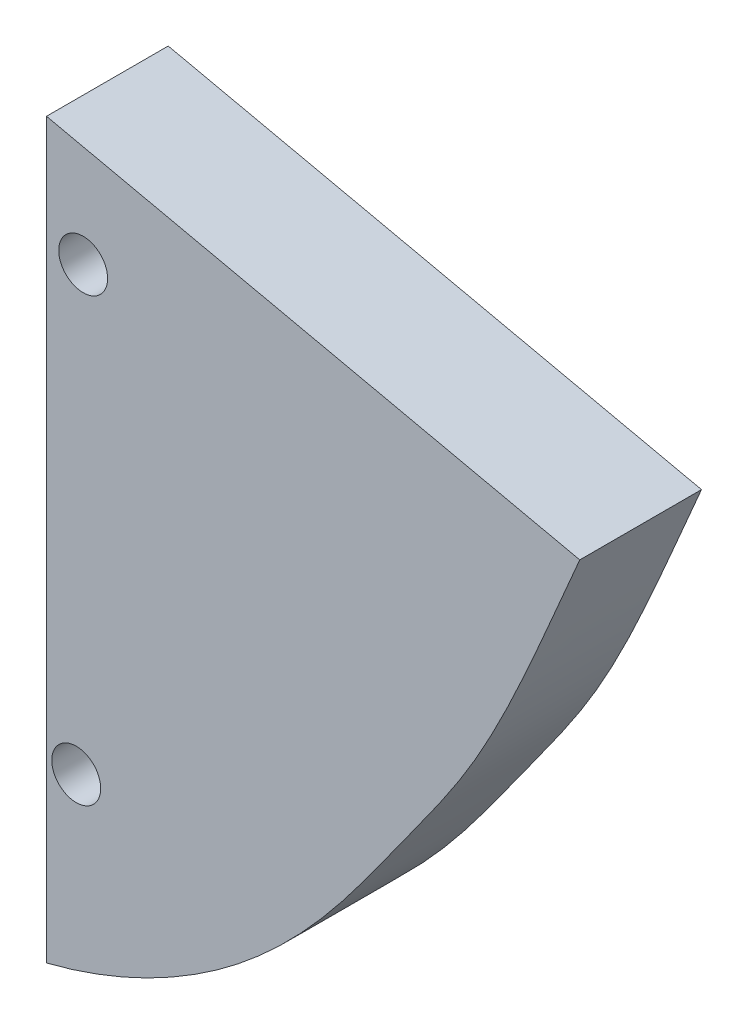
ISO-10303-21;
HEADER;
FILE_DESCRIPTION(('STEP AP214'),'2;1');
FILE_NAME('part.step','',(''),(''),'','','');
FILE_SCHEMA(('AUTOMOTIVE_DESIGN { 1 0 10303 214 1 1 1 1 }'));
ENDSEC;
DATA;
#1=APPLICATION_CONTEXT('core data for automotive mechanical design processes');
#2=APPLICATION_PROTOCOL_DEFINITION('international standard','automotive_design',2000,#1);
#3=PRODUCT_CONTEXT('',#1,'mechanical');
#4=PRODUCT('Part','Part','',(#3));
#5=PRODUCT_RELATED_PRODUCT_CATEGORY('part','',(#4));
#6=PRODUCT_DEFINITION_FORMATION('','',#4);
#7=PRODUCT_DEFINITION_CONTEXT('part definition',#1,'design');
#8=PRODUCT_DEFINITION('design','',#6,#7);
#9=PRODUCT_DEFINITION_SHAPE('','',#8);
#10=(LENGTH_UNIT() NAMED_UNIT(*) SI_UNIT(.MILLI.,.METRE.));
#11=(NAMED_UNIT(*) PLANE_ANGLE_UNIT() SI_UNIT($,.RADIAN.));
#12=(NAMED_UNIT(*) SI_UNIT($,.STERADIAN.) SOLID_ANGLE_UNIT());
#13=UNCERTAINTY_MEASURE_WITH_UNIT(LENGTH_MEASURE(1.E-05),#10,'distance_accuracy_value','');
#14=(GEOMETRIC_REPRESENTATION_CONTEXT(3) GLOBAL_UNCERTAINTY_ASSIGNED_CONTEXT((#13)) GLOBAL_UNIT_ASSIGNED_CONTEXT((#10,
#11,#12)) REPRESENTATION_CONTEXT('',''));
#15=CARTESIAN_POINT('',(0.,0.,0.));
#16=DIRECTION('',(0.,0.,1.));
#17=DIRECTION('',(1.,0.,0.));
#18=AXIS2_PLACEMENT_3D('',#15,#16,#17);
#19=CARTESIAN_POINT('',(0.,-4.,4.98));
#20=CARTESIAN_POINT('',(2.9067649308255,-3.2679038016806,4.98));
#21=CARTESIAN_POINT('',(7.18942457178566,-1.09186569585447,4.98));
#22=CARTESIAN_POINT('',(11.6437366225917,3.46078876085689,4.98));
#23=CARTESIAN_POINT('',(14.473771474054,7.48084114476038,4.98));
#24=CARTESIAN_POINT('',(17.3377801250555,11.3692603646736,4.98));
#25=CARTESIAN_POINT('',(19.6480759454628,16.032903585408,4.98));
#26=CARTESIAN_POINT('',(21.0177099191527,19.3555821053084,4.98));
#27=CARTESIAN_POINT('',(21.8168612474579,21.1914102612986,4.98));
#28=B_SPLINE_CURVE_WITH_KNOTS('',3,(#19,#20,#21,#22,#23,#24,#25,#26,#27),.UNSPECIFIED.,.F.,.F.,
(4,1,1,1,1,1,4),(0.,0.260017683149919,0.407189490212177,0.549306039511552,0.687276252070777,
0.826057345620301,1.),.UNSPECIFIED.);
#29=DIRECTION('',(0.,0.,-1.));
#30=VECTOR('',#29,1.);
#31=SURFACE_OF_LINEAR_EXTRUSION('',#28,#30);
#32=CARTESIAN_POINT('',(0.,-4.,0.));
#33=CARTESIAN_POINT('',(2.9067649308255,-3.2679038016806,0.));
#34=CARTESIAN_POINT('',(7.18942457178566,-1.09186569585447,0.));
#35=CARTESIAN_POINT('',(11.6437366225917,3.46078876085689,0.));
#36=CARTESIAN_POINT('',(14.473771474054,7.48084114476038,0.));
#37=CARTESIAN_POINT('',(17.3377801250555,11.3692603646736,0.));
#38=CARTESIAN_POINT('',(19.6480759454628,16.032903585408,0.));
#39=CARTESIAN_POINT('',(21.0177099191527,19.3555821053084,0.));
#40=CARTESIAN_POINT('',(21.8168612474579,21.1914102612986,0.));
#41=B_SPLINE_CURVE_WITH_KNOTS('',3,(#32,#33,#34,#35,#36,#37,#38,#39,#40),.UNSPECIFIED.,.F.,.F.,
(4,1,1,1,1,1,4),(0.,0.260017683149919,0.407189490212177,0.549306039511552,0.687276252070777,
0.826057345620301,1.),.UNSPECIFIED.);
#42=CARTESIAN_POINT('',(0.,-4.,0.));
#43=VERTEX_POINT('',#42);
#44=CARTESIAN_POINT('',(21.8168612474579,21.1914102612986,0.));
#45=VERTEX_POINT('',#44);
#46=EDGE_CURVE('E85',#43,#45,#41,.T.);
#47=ORIENTED_EDGE('',*,*,#46,.T.);
#48=DIRECTION('',(0.,0.,-1.));
#49=VECTOR('',#48,1.);
#50=CARTESIAN_POINT('',(21.8168612474579,21.1914102612986,4.98));
#51=LINE('',#50,#49);
#52=CARTESIAN_POINT('',(21.8168612474579,21.1914102612986,4.98));
#53=VERTEX_POINT('',#52);
#54=EDGE_CURVE('E11',#53,#45,#51,.T.);
#55=ORIENTED_EDGE('',*,*,#54,.F.);
#56=CARTESIAN_POINT('',(0.,-4.,4.98));
#57=VERTEX_POINT('',#56);
#58=EDGE_CURVE('E79',#57,#53,#28,.T.);
#59=ORIENTED_EDGE('',*,*,#58,.F.);
#60=DIRECTION('',(0.,0.,-1.));
#61=VECTOR('',#60,1.);
#62=CARTESIAN_POINT('',(0.,-4.,4.98));
#63=LINE('',#62,#61);
#64=EDGE_CURVE('E86',#57,#43,#63,.T.);
#65=ORIENTED_EDGE('',*,*,#64,.T.);
#66=EDGE_LOOP('',(#47,#55,#59,#65));
#67=FACE_BOUND('',#66,.T.);
#68=ADVANCED_FACE('F37',(#67),#31,.F.);
#69=CARTESIAN_POINT('',(0.,26.,4.98));
#70=DIRECTION('',(-0.215240912045442,-0.976560981087124,0.));
#71=DIRECTION('',(0.976560981087124,-0.215240912045442,0.));
#72=AXIS2_PLACEMENT_3D('',#69,#70,#71);
#73=PLANE('',#72);
#74=DIRECTION('',(-0.976560981087124,0.215240912045442,0.));
#75=VECTOR('',#74,1.);
#76=CARTESIAN_POINT('',(0.,26.,0.));
#77=LINE('',#76,#75);
#78=CARTESIAN_POINT('',(0.,26.,0.));
#79=VERTEX_POINT('',#78);
#80=EDGE_CURVE('E67',#45,#79,#77,.T.);
#81=ORIENTED_EDGE('',*,*,#80,.T.);
#82=DIRECTION('',(0.,0.,-1.));
#83=VECTOR('',#82,1.);
#84=CARTESIAN_POINT('',(0.,26.,4.98));
#85=LINE('',#84,#83);
#86=CARTESIAN_POINT('',(0.,26.,4.98));
#87=VERTEX_POINT('',#86);
#88=EDGE_CURVE('E47',#87,#79,#85,.T.);
#89=ORIENTED_EDGE('',*,*,#88,.F.);
#90=DIRECTION('',(-0.976560981087124,0.215240912045442,0.));
#91=VECTOR('',#90,1.);
#92=CARTESIAN_POINT('',(0.,26.,4.98));
#93=LINE('',#92,#91);
#94=EDGE_CURVE('E75',#53,#87,#93,.T.);
#95=ORIENTED_EDGE('',*,*,#94,.F.);
#96=ORIENTED_EDGE('',*,*,#54,.T.);
#97=EDGE_LOOP('',(#81,#89,#95,#96));
#98=FACE_BOUND('',#97,.T.);
#99=ADVANCED_FACE('F76',(#98),#73,.F.);
#100=CARTESIAN_POINT('',(0.,-4.,4.98));
#101=DIRECTION('',(1.,0.,0.));
#102=DIRECTION('',(0.,0.,-1.));
#103=AXIS2_PLACEMENT_3D('',#100,#101,#102);
#104=PLANE('',#103);
#105=DIRECTION('',(0.,-1.,0.));
#106=VECTOR('',#105,1.);
#107=CARTESIAN_POINT('',(0.,-4.,0.));
#108=LINE('',#107,#106);
#109=EDGE_CURVE('E72',#79,#43,#108,.T.);
#110=ORIENTED_EDGE('',*,*,#109,.T.);
#111=ORIENTED_EDGE('',*,*,#64,.F.);
#112=DIRECTION('',(0.,-1.,0.));
#113=VECTOR('',#112,1.);
#114=CARTESIAN_POINT('',(0.,-4.,4.98));
#115=LINE('',#114,#113);
#116=EDGE_CURVE('E55',#87,#57,#115,.T.);
#117=ORIENTED_EDGE('',*,*,#116,.F.);
#118=ORIENTED_EDGE('',*,*,#88,.T.);
#119=EDGE_LOOP('',(#110,#111,#117,#118));
#120=FACE_BOUND('',#119,.T.);
#121=ADVANCED_FACE('F101',(#120),#104,.F.);
#122=CARTESIAN_POINT('',(13.5214330001257,6.12884232732256,4.98));
#123=DIRECTION('',(0.,0.,-1.));
#124=DIRECTION('',(-1.,0.,0.));
#125=AXIS2_PLACEMENT_3D('',#122,#123,#124);
#126=PLANE('',#125);
#127=CARTESIAN_POINT('',(1.21673510359839,3.29106037852808,4.98));
#128=DIRECTION('',(0.,0.,1.));
#129=DIRECTION('',(1.,0.,0.));
#130=AXIS2_PLACEMENT_3D('',#127,#128,#129);
#131=CIRCLE('',#130,1.);
#132=CARTESIAN_POINT('',(2.21673510359839,3.29106037852808,4.98));
#133=VERTEX_POINT('',#132);
#134=EDGE_CURVE('E152',#133,#133,#131,.T.);
#135=ORIENTED_EDGE('',*,*,#134,.F.);
#136=EDGE_LOOP('',(#135));
#137=FACE_BOUND('',#136,.T.);
#138=CARTESIAN_POINT('',(1.5,21.5,4.98));
#139=DIRECTION('',(0.,0.,1.));
#140=DIRECTION('',(1.,0.,0.));
#141=AXIS2_PLACEMENT_3D('',#138,#139,#140);
#142=CIRCLE('',#141,1.);
#143=CARTESIAN_POINT('',(2.5,21.5,4.98));
#144=VERTEX_POINT('',#143);
#145=EDGE_CURVE('E91',#144,#144,#142,.T.);
#146=ORIENTED_EDGE('',*,*,#145,.F.);
#147=EDGE_LOOP('',(#146));
#148=FACE_BOUND('',#147,.T.);
#149=ORIENTED_EDGE('',*,*,#58,.T.);
#150=ORIENTED_EDGE('',*,*,#94,.T.);
#151=ORIENTED_EDGE('',*,*,#116,.T.);
#152=EDGE_LOOP('',(#149,#150,#151));
#153=FACE_BOUND('',#152,.T.);
#154=ADVANCED_FACE('F82',(#137,#148,#153),#126,.F.);
#155=CARTESIAN_POINT('',(13.5214330001257,6.12884232732256,0.));
#156=DIRECTION('',(0.,0.,-1.));
#157=DIRECTION('',(-1.,0.,0.));
#158=AXIS2_PLACEMENT_3D('',#155,#156,#157);
#159=PLANE('',#158);
#160=CARTESIAN_POINT('',(1.21673510359839,3.29106037852808,0.));
#161=DIRECTION('',(0.,0.,-1.));
#162=DIRECTION('',(-1.,0.,0.));
#163=AXIS2_PLACEMENT_3D('',#160,#161,#162);
#164=CIRCLE('',#163,1.);
#165=CARTESIAN_POINT('',(0.21673510359839,3.29106037852808,0.));
#166=VERTEX_POINT('',#165);
#167=EDGE_CURVE('E149',#166,#166,#164,.F.);
#168=ORIENTED_EDGE('',*,*,#167,.T.);
#169=EDGE_LOOP('',(#168));
#170=FACE_BOUND('',#169,.T.);
#171=CARTESIAN_POINT('',(1.5,21.5,0.));
#172=DIRECTION('',(0.,0.,-1.));
#173=DIRECTION('',(-1.,0.,0.));
#174=AXIS2_PLACEMENT_3D('',#171,#172,#173);
#175=CIRCLE('',#174,1.);
#176=CARTESIAN_POINT('',(0.499999999999999,21.5,0.));
#177=VERTEX_POINT('',#176);
#178=EDGE_CURVE('E41',#177,#177,#175,.T.);
#179=ORIENTED_EDGE('',*,*,#178,.F.);
#180=EDGE_LOOP('',(#179));
#181=FACE_BOUND('',#180,.T.);
#182=ORIENTED_EDGE('',*,*,#46,.F.);
#183=ORIENTED_EDGE('',*,*,#109,.F.);
#184=ORIENTED_EDGE('',*,*,#80,.F.);
#185=EDGE_LOOP('',(#182,#183,#184));
#186=FACE_BOUND('',#185,.T.);
#187=ADVANCED_FACE('F102',(#170,#181,#186),#159,.T.);
#188=CARTESIAN_POINT('',(1.5,21.5,-0.0200000000000001));
#189=DIRECTION('',(0.,0.,1.));
#190=DIRECTION('',(1.,0.,0.));
#191=AXIS2_PLACEMENT_3D('',#188,#189,#190);
#192=CYLINDRICAL_SURFACE('',#191,1.);
#193=ORIENTED_EDGE('',*,*,#178,.T.);
#194=EDGE_LOOP('',(#193));
#195=FACE_BOUND('',#194,.T.);
#196=ORIENTED_EDGE('',*,*,#145,.T.);
#197=EDGE_LOOP('',(#196));
#198=FACE_BOUND('',#197,.T.);
#199=ADVANCED_FACE('F104',(#195,#198),#192,.F.);
#200=CARTESIAN_POINT('',(1.21673510359839,3.29106037852808,-0.00100000000000013));
#201=DIRECTION('',(0.,0.,1.));
#202=DIRECTION('',(1.,0.,0.));
#203=AXIS2_PLACEMENT_3D('',#200,#201,#202);
#204=CYLINDRICAL_SURFACE('',#203,1.);
#205=ORIENTED_EDGE('',*,*,#167,.F.);
#206=EDGE_LOOP('',(#205));
#207=FACE_BOUND('',#206,.T.);
#208=ORIENTED_EDGE('',*,*,#134,.T.);
#209=EDGE_LOOP('',(#208));
#210=FACE_BOUND('',#209,.T.);
#211=ADVANCED_FACE('F112',(#207,#210),#204,.F.);
#212=CLOSED_SHELL('',(#68,#99,#121,#154,#187,#199,#211));
#213=MANIFOLD_SOLID_BREP('B2',#212);
#214=ADVANCED_BREP_SHAPE_REPRESENTATION('',(#18,#213),#14);
#215=SHAPE_DEFINITION_REPRESENTATION(#9,#214);
ENDSEC;
END-ISO-10303-21;
